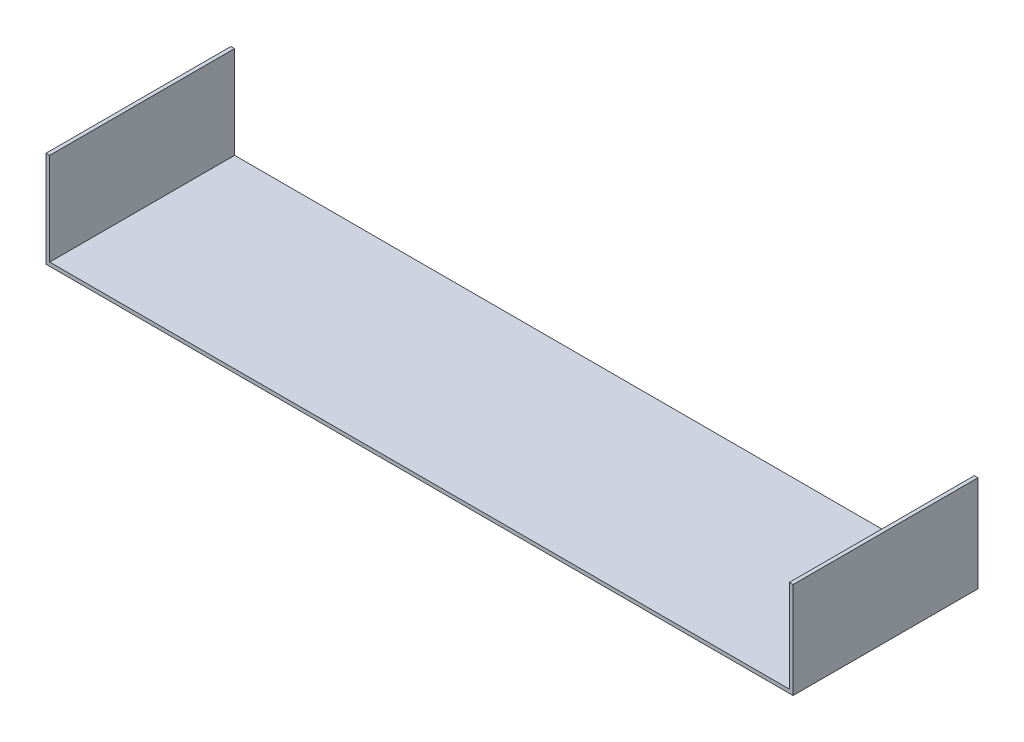
ISO-10303-21;
HEADER;
FILE_DESCRIPTION(('STEP AP214'),'2;1');
FILE_NAME('part.step','',(''),(''),'','','');
FILE_SCHEMA(('AUTOMOTIVE_DESIGN { 1 0 10303 214 1 1 1 1 }'));
ENDSEC;
DATA;
#1=APPLICATION_CONTEXT('core data for automotive mechanical design processes');
#2=APPLICATION_PROTOCOL_DEFINITION('international standard','automotive_design',2000,#1);
#3=PRODUCT_CONTEXT('',#1,'mechanical');
#4=PRODUCT('Part','Part','',(#3));
#5=PRODUCT_RELATED_PRODUCT_CATEGORY('part','',(#4));
#6=PRODUCT_DEFINITION_FORMATION('','',#4);
#7=PRODUCT_DEFINITION_CONTEXT('part definition',#1,'design');
#8=PRODUCT_DEFINITION('design','',#6,#7);
#9=PRODUCT_DEFINITION_SHAPE('','',#8);
#10=(LENGTH_UNIT() NAMED_UNIT(*) SI_UNIT(.MILLI.,.METRE.));
#11=(NAMED_UNIT(*) PLANE_ANGLE_UNIT() SI_UNIT($,.RADIAN.));
#12=(NAMED_UNIT(*) SI_UNIT($,.STERADIAN.) SOLID_ANGLE_UNIT());
#13=UNCERTAINTY_MEASURE_WITH_UNIT(LENGTH_MEASURE(1.E-05),#10,'distance_accuracy_value','');
#14=(GEOMETRIC_REPRESENTATION_CONTEXT(3) GLOBAL_UNCERTAINTY_ASSIGNED_CONTEXT((#13)) GLOBAL_UNIT_ASSIGNED_CONTEXT((#10,
#11,#12)) REPRESENTATION_CONTEXT('',''));
#15=CARTESIAN_POINT('',(0.,0.,0.));
#16=DIRECTION('',(0.,0.,1.));
#17=DIRECTION('',(1.,0.,0.));
#18=AXIS2_PLACEMENT_3D('',#15,#16,#17);
#19=CARTESIAN_POINT('',(-200.,0.,-10000.));
#20=DIRECTION('',(0.,1.,0.));
#21=DIRECTION('',(0.,0.,1.));
#22=AXIS2_PLACEMENT_3D('',#19,#20,#21);
#23=PLANE('',#22);
#24=DIRECTION('',(-1.,0.,0.));
#25=VECTOR('',#24,1.);
#26=CARTESIAN_POINT('',(-200.,0.,0.));
#27=LINE('',#26,#25);
#28=CARTESIAN_POINT('',(0.,0.,0.));
#29=VERTEX_POINT('',#28);
#30=CARTESIAN_POINT('',(-200.,0.,0.));
#31=VERTEX_POINT('',#30);
#32=EDGE_CURVE('E138',#29,#31,#27,.T.);
#33=ORIENTED_EDGE('',*,*,#32,.F.);
#34=DIRECTION('',(0.,0.,1.));
#35=VECTOR('',#34,1.);
#36=CARTESIAN_POINT('',(0.,0.,-10000.));
#37=LINE('',#36,#35);
#38=CARTESIAN_POINT('',(0.,0.,-10000.));
#39=VERTEX_POINT('',#38);
#40=EDGE_CURVE('E11',#39,#29,#37,.T.);
#41=ORIENTED_EDGE('',*,*,#40,.F.);
#42=DIRECTION('',(-1.,0.,0.));
#43=VECTOR('',#42,1.);
#44=CARTESIAN_POINT('',(-200.,0.,-10000.));
#45=LINE('',#44,#43);
#46=CARTESIAN_POINT('',(-200.,0.,-10000.));
#47=VERTEX_POINT('',#46);
#48=EDGE_CURVE('E158',#39,#47,#45,.T.);
#49=ORIENTED_EDGE('',*,*,#48,.T.);
#50=DIRECTION('',(0.,0.,1.));
#51=VECTOR('',#50,1.);
#52=CARTESIAN_POINT('',(-200.,0.,-10000.));
#53=LINE('',#52,#51);
#54=EDGE_CURVE('E44',#47,#31,#53,.T.);
#55=ORIENTED_EDGE('',*,*,#54,.T.);
#56=EDGE_LOOP('',(#33,#41,#49,#55));
#57=FACE_BOUND('',#56,.T.);
#58=ADVANCED_FACE('F41',(#57),#23,.T.);
#59=CARTESIAN_POINT('',(0.,0.,-10000.));
#60=DIRECTION('',(1.,0.,0.));
#61=DIRECTION('',(0.,0.,-1.));
#62=AXIS2_PLACEMENT_3D('',#59,#60,#61);
#63=PLANE('',#62);
#64=DIRECTION('',(0.,1.,0.));
#65=VECTOR('',#64,1.);
#66=CARTESIAN_POINT('',(0.,0.,0.));
#67=LINE('',#66,#65);
#68=CARTESIAN_POINT('',(0.,-5000.,0.));
#69=VERTEX_POINT('',#68);
#70=EDGE_CURVE('E156',#69,#29,#67,.T.);
#71=ORIENTED_EDGE('',*,*,#70,.F.);
#72=DIRECTION('',(0.,0.,1.));
#73=VECTOR('',#72,1.);
#74=CARTESIAN_POINT('',(0.,-5000.,-10000.));
#75=LINE('',#74,#73);
#76=CARTESIAN_POINT('',(0.,-5000.,-10000.));
#77=VERTEX_POINT('',#76);
#78=EDGE_CURVE('E50',#77,#69,#75,.T.);
#79=ORIENTED_EDGE('',*,*,#78,.F.);
#80=DIRECTION('',(0.,1.,0.));
#81=VECTOR('',#80,1.);
#82=CARTESIAN_POINT('',(0.,0.,-10000.));
#83=LINE('',#82,#81);
#84=EDGE_CURVE('E128',#77,#39,#83,.T.);
#85=ORIENTED_EDGE('',*,*,#84,.T.);
#86=ORIENTED_EDGE('',*,*,#40,.T.);
#87=EDGE_LOOP('',(#71,#79,#85,#86));
#88=FACE_BOUND('',#87,.T.);
#89=ADVANCED_FACE('F170',(#88),#63,.T.);
#90=CARTESIAN_POINT('',(0.,-5000.,-10000.));
#91=DIRECTION('',(0.,1.,0.));
#92=DIRECTION('',(0.,0.,1.));
#93=AXIS2_PLACEMENT_3D('',#90,#91,#92);
#94=PLANE('',#93);
#95=DIRECTION('',(-1.,0.,0.));
#96=VECTOR('',#95,1.);
#97=CARTESIAN_POINT('',(0.,-5000.,0.));
#98=LINE('',#97,#96);
#99=CARTESIAN_POINT('',(40000.,-5000.,0.));
#100=VERTEX_POINT('',#99);
#101=EDGE_CURVE('E115',#100,#69,#98,.T.);
#102=ORIENTED_EDGE('',*,*,#101,.F.);
#103=DIRECTION('',(0.,0.,1.));
#104=VECTOR('',#103,1.);
#105=CARTESIAN_POINT('',(40000.,-5000.,-10000.));
#106=LINE('',#105,#104);
#107=CARTESIAN_POINT('',(40000.,-5000.,-10000.));
#108=VERTEX_POINT('',#107);
#109=EDGE_CURVE('E110',#108,#100,#106,.T.);
#110=ORIENTED_EDGE('',*,*,#109,.F.);
#111=DIRECTION('',(-1.,0.,0.));
#112=VECTOR('',#111,1.);
#113=CARTESIAN_POINT('',(0.,-5000.,-10000.));
#114=LINE('',#113,#112);
#115=EDGE_CURVE('E113',#108,#77,#114,.T.);
#116=ORIENTED_EDGE('',*,*,#115,.T.);
#117=ORIENTED_EDGE('',*,*,#78,.T.);
#118=EDGE_LOOP('',(#102,#110,#116,#117));
#119=FACE_BOUND('',#118,.T.);
#120=ADVANCED_FACE('F112',(#119),#94,.T.);
#121=CARTESIAN_POINT('',(40000.,-5000.,-10000.));
#122=DIRECTION('',(-1.,0.,0.));
#123=DIRECTION('',(0.,0.,1.));
#124=AXIS2_PLACEMENT_3D('',#121,#122,#123);
#125=PLANE('',#124);
#126=DIRECTION('',(0.,-1.,0.));
#127=VECTOR('',#126,1.);
#128=CARTESIAN_POINT('',(40000.,-5000.,0.));
#129=LINE('',#128,#127);
#130=CARTESIAN_POINT('',(40000.,0.,0.));
#131=VERTEX_POINT('',#130);
#132=EDGE_CURVE('E153',#131,#100,#129,.T.);
#133=ORIENTED_EDGE('',*,*,#132,.F.);
#134=DIRECTION('',(0.,0.,1.));
#135=VECTOR('',#134,1.);
#136=CARTESIAN_POINT('',(40000.,0.,-10000.));
#137=LINE('',#136,#135);
#138=CARTESIAN_POINT('',(40000.,0.,-10000.));
#139=VERTEX_POINT('',#138);
#140=EDGE_CURVE('E120',#139,#131,#137,.T.);
#141=ORIENTED_EDGE('',*,*,#140,.F.);
#142=DIRECTION('',(0.,-1.,0.));
#143=VECTOR('',#142,1.);
#144=CARTESIAN_POINT('',(40000.,-5000.,-10000.));
#145=LINE('',#144,#143);
#146=EDGE_CURVE('E126',#139,#108,#145,.T.);
#147=ORIENTED_EDGE('',*,*,#146,.T.);
#148=ORIENTED_EDGE('',*,*,#109,.T.);
#149=EDGE_LOOP('',(#133,#141,#147,#148));
#150=FACE_BOUND('',#149,.T.);
#151=ADVANCED_FACE('F130',(#150),#125,.T.);
#152=CARTESIAN_POINT('',(40000.,0.,-10000.));
#153=DIRECTION('',(0.,1.,0.));
#154=DIRECTION('',(0.,0.,1.));
#155=AXIS2_PLACEMENT_3D('',#152,#153,#154);
#156=PLANE('',#155);
#157=DIRECTION('',(-1.,0.,0.));
#158=VECTOR('',#157,1.);
#159=CARTESIAN_POINT('',(40000.,0.,0.));
#160=LINE('',#159,#158);
#161=CARTESIAN_POINT('',(40200.,0.,0.));
#162=VERTEX_POINT('',#161);
#163=EDGE_CURVE('E150',#162,#131,#160,.T.);
#164=ORIENTED_EDGE('',*,*,#163,.F.);
#165=DIRECTION('',(0.,0.,1.));
#166=VECTOR('',#165,1.);
#167=CARTESIAN_POINT('',(40200.,0.,-10000.));
#168=LINE('',#167,#166);
#169=CARTESIAN_POINT('',(40200.,0.,-10000.));
#170=VERTEX_POINT('',#169);
#171=EDGE_CURVE('E162',#170,#162,#168,.T.);
#172=ORIENTED_EDGE('',*,*,#171,.F.);
#173=DIRECTION('',(-1.,0.,0.));
#174=VECTOR('',#173,1.);
#175=CARTESIAN_POINT('',(40000.,0.,-10000.));
#176=LINE('',#175,#174);
#177=EDGE_CURVE('E131',#170,#139,#176,.T.);
#178=ORIENTED_EDGE('',*,*,#177,.T.);
#179=ORIENTED_EDGE('',*,*,#140,.T.);
#180=EDGE_LOOP('',(#164,#172,#178,#179));
#181=FACE_BOUND('',#180,.T.);
#182=ADVANCED_FACE('F183',(#181),#156,.T.);
#183=CARTESIAN_POINT('',(40200.,-5200.,-10000.));
#184=DIRECTION('',(1.,0.,0.));
#185=DIRECTION('',(0.,0.,-1.));
#186=AXIS2_PLACEMENT_3D('',#183,#184,#185);
#187=PLANE('',#186);
#188=DIRECTION('',(0.,1.,0.));
#189=VECTOR('',#188,1.);
#190=CARTESIAN_POINT('',(40200.,-5200.,0.));
#191=LINE('',#190,#189);
#192=CARTESIAN_POINT('',(40200.,-5200.,0.));
#193=VERTEX_POINT('',#192);
#194=EDGE_CURVE('E147',#193,#162,#191,.T.);
#195=ORIENTED_EDGE('',*,*,#194,.F.);
#196=DIRECTION('',(0.,0.,1.));
#197=VECTOR('',#196,1.);
#198=CARTESIAN_POINT('',(40200.,-5200.,-10000.));
#199=LINE('',#198,#197);
#200=CARTESIAN_POINT('',(40200.,-5200.,-10000.));
#201=VERTEX_POINT('',#200);
#202=EDGE_CURVE('E164',#201,#193,#199,.T.);
#203=ORIENTED_EDGE('',*,*,#202,.F.);
#204=DIRECTION('',(0.,1.,0.));
#205=VECTOR('',#204,1.);
#206=CARTESIAN_POINT('',(40200.,-5200.,-10000.));
#207=LINE('',#206,#205);
#208=EDGE_CURVE('E133',#201,#170,#207,.T.);
#209=ORIENTED_EDGE('',*,*,#208,.T.);
#210=ORIENTED_EDGE('',*,*,#171,.T.);
#211=EDGE_LOOP('',(#195,#203,#209,#210));
#212=FACE_BOUND('',#211,.T.);
#213=ADVANCED_FACE('F186',(#212),#187,.T.);
#214=CARTESIAN_POINT('',(-200.,-5200.,-10000.));
#215=DIRECTION('',(0.,-1.,0.));
#216=DIRECTION('',(1.,0.,0.));
#217=AXIS2_PLACEMENT_3D('',#214,#215,#216);
#218=PLANE('',#217);
#219=DIRECTION('',(1.,0.,0.));
#220=VECTOR('',#219,1.);
#221=CARTESIAN_POINT('',(-200.,-5200.,0.));
#222=LINE('',#221,#220);
#223=CARTESIAN_POINT('',(-200.,-5200.,0.));
#224=VERTEX_POINT('',#223);
#225=EDGE_CURVE('E144',#224,#193,#222,.T.);
#226=ORIENTED_EDGE('',*,*,#225,.F.);
#227=DIRECTION('',(0.,0.,1.));
#228=VECTOR('',#227,1.);
#229=CARTESIAN_POINT('',(-200.,-5200.,-10000.));
#230=LINE('',#229,#228);
#231=CARTESIAN_POINT('',(-200.,-5200.,-10000.));
#232=VERTEX_POINT('',#231);
#233=EDGE_CURVE('E165',#232,#224,#230,.T.);
#234=ORIENTED_EDGE('',*,*,#233,.F.);
#235=DIRECTION('',(1.,0.,0.));
#236=VECTOR('',#235,1.);
#237=CARTESIAN_POINT('',(-200.,-5200.,-10000.));
#238=LINE('',#237,#236);
#239=EDGE_CURVE('E281',#232,#201,#238,.T.);
#240=ORIENTED_EDGE('',*,*,#239,.T.);
#241=ORIENTED_EDGE('',*,*,#202,.T.);
#242=EDGE_LOOP('',(#226,#234,#240,#241));
#243=FACE_BOUND('',#242,.T.);
#244=ADVANCED_FACE('F190',(#243),#218,.T.);
#245=CARTESIAN_POINT('',(-200.,0.,-10000.));
#246=DIRECTION('',(-1.,0.,0.));
#247=DIRECTION('',(0.,0.,1.));
#248=AXIS2_PLACEMENT_3D('',#245,#246,#247);
#249=PLANE('',#248);
#250=DIRECTION('',(0.,-1.,0.));
#251=VECTOR('',#250,1.);
#252=CARTESIAN_POINT('',(-200.,0.,0.));
#253=LINE('',#252,#251);
#254=EDGE_CURVE('E141',#31,#224,#253,.T.);
#255=ORIENTED_EDGE('',*,*,#254,.F.);
#256=ORIENTED_EDGE('',*,*,#54,.F.);
#257=DIRECTION('',(0.,-1.,0.));
#258=VECTOR('',#257,1.);
#259=CARTESIAN_POINT('',(-200.,0.,-10000.));
#260=LINE('',#259,#258);
#261=EDGE_CURVE('E282',#47,#232,#260,.T.);
#262=ORIENTED_EDGE('',*,*,#261,.T.);
#263=ORIENTED_EDGE('',*,*,#233,.T.);
#264=EDGE_LOOP('',(#255,#256,#262,#263));
#265=FACE_BOUND('',#264,.T.);
#266=ADVANCED_FACE('F167',(#265),#249,.T.);
#267=CARTESIAN_POINT('',(0.,0.,-10000.));
#268=DIRECTION('',(0.,0.,-1.));
#269=DIRECTION('',(-1.,0.,0.));
#270=AXIS2_PLACEMENT_3D('',#267,#268,#269);
#271=PLANE('',#270);
#272=ORIENTED_EDGE('',*,*,#48,.F.);
#273=ORIENTED_EDGE('',*,*,#84,.F.);
#274=ORIENTED_EDGE('',*,*,#115,.F.);
#275=ORIENTED_EDGE('',*,*,#146,.F.);
#276=ORIENTED_EDGE('',*,*,#177,.F.);
#277=ORIENTED_EDGE('',*,*,#208,.F.);
#278=ORIENTED_EDGE('',*,*,#239,.F.);
#279=ORIENTED_EDGE('',*,*,#261,.F.);
#280=EDGE_LOOP('',(#272,#273,#274,#275,#276,#277,#278,#279));
#281=FACE_BOUND('',#280,.T.);
#282=ADVANCED_FACE('F124',(#281),#271,.T.);
#283=CARTESIAN_POINT('',(0.,0.,0.));
#284=DIRECTION('',(0.,0.,-1.));
#285=DIRECTION('',(-1.,0.,0.));
#286=AXIS2_PLACEMENT_3D('',#283,#284,#285);
#287=PLANE('',#286);
#288=ORIENTED_EDGE('',*,*,#32,.T.);
#289=ORIENTED_EDGE('',*,*,#254,.T.);
#290=ORIENTED_EDGE('',*,*,#225,.T.);
#291=ORIENTED_EDGE('',*,*,#194,.T.);
#292=ORIENTED_EDGE('',*,*,#163,.T.);
#293=ORIENTED_EDGE('',*,*,#132,.T.);
#294=ORIENTED_EDGE('',*,*,#101,.T.);
#295=ORIENTED_EDGE('',*,*,#70,.T.);
#296=EDGE_LOOP('',(#288,#289,#290,#291,#292,#293,#294,#295));
#297=FACE_BOUND('',#296,.T.);
#298=ADVANCED_FACE('F169',(#297),#287,.F.);
#299=CLOSED_SHELL('',(#58,#89,#120,#151,#182,#213,#244,#266,#282,#298));
#300=MANIFOLD_SOLID_BREP('B2',#299);
#301=ADVANCED_BREP_SHAPE_REPRESENTATION('',(#18,#300),#14);
#302=SHAPE_DEFINITION_REPRESENTATION(#9,#301);
ENDSEC;
END-ISO-10303-21;
